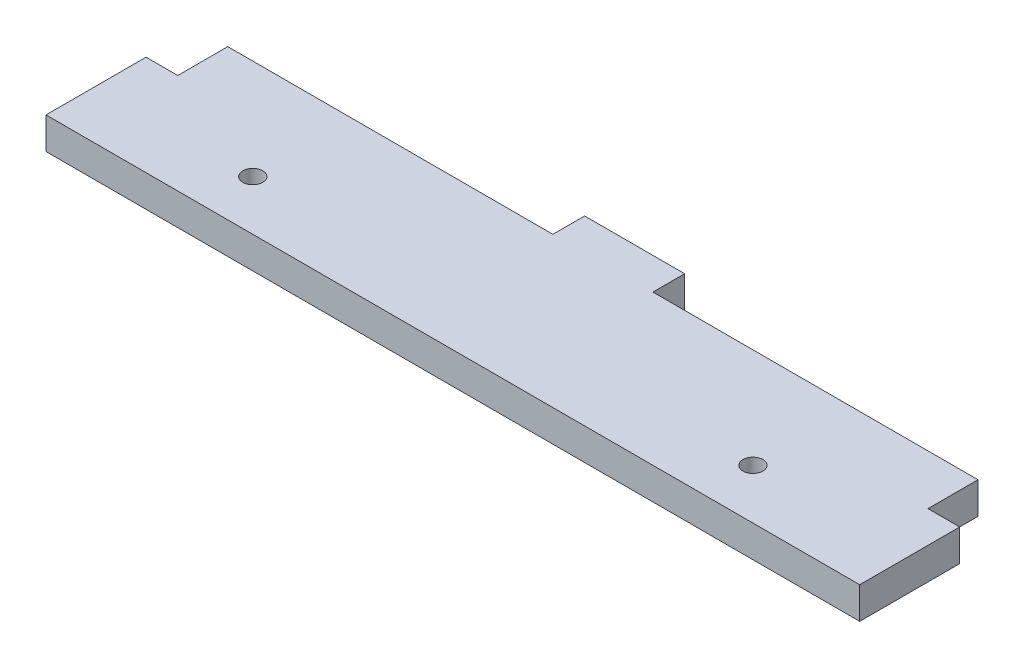
ISO-10303-21;
HEADER;
FILE_DESCRIPTION(('STEP AP214'),'2;1');
FILE_NAME('part.step','',(''),(''),'','','');
FILE_SCHEMA(('AUTOMOTIVE_DESIGN { 1 0 10303 214 1 1 1 1 }'));
ENDSEC;
DATA;
#1=APPLICATION_CONTEXT('core data for automotive mechanical design processes');
#2=APPLICATION_PROTOCOL_DEFINITION('international standard','automotive_design',2000,#1);
#3=PRODUCT_CONTEXT('',#1,'mechanical');
#4=PRODUCT('Part','Part','',(#3));
#5=PRODUCT_RELATED_PRODUCT_CATEGORY('part','',(#4));
#6=PRODUCT_DEFINITION_FORMATION('','',#4);
#7=PRODUCT_DEFINITION_CONTEXT('part definition',#1,'design');
#8=PRODUCT_DEFINITION('design','',#6,#7);
#9=PRODUCT_DEFINITION_SHAPE('','',#8);
#10=(LENGTH_UNIT() NAMED_UNIT(*) SI_UNIT(.MILLI.,.METRE.));
#11=(NAMED_UNIT(*) PLANE_ANGLE_UNIT() SI_UNIT($,.RADIAN.));
#12=(NAMED_UNIT(*) SI_UNIT($,.STERADIAN.) SOLID_ANGLE_UNIT());
#13=UNCERTAINTY_MEASURE_WITH_UNIT(LENGTH_MEASURE(1.E-05),#10,'distance_accuracy_value','');
#14=(GEOMETRIC_REPRESENTATION_CONTEXT(3) GLOBAL_UNCERTAINTY_ASSIGNED_CONTEXT((#13)) GLOBAL_UNIT_ASSIGNED_CONTEXT((#10,
#11,#12)) REPRESENTATION_CONTEXT('',''));
#15=CARTESIAN_POINT('',(0.,0.,0.));
#16=DIRECTION('',(0.,0.,1.));
#17=DIRECTION('',(1.,0.,0.));
#18=AXIS2_PLACEMENT_3D('',#15,#16,#17);
#19=CARTESIAN_POINT('',(0.,3.175,0.));
#20=DIRECTION('',(0.,1.,0.));
#21=DIRECTION('',(0.,0.,1.));
#22=AXIS2_PLACEMENT_3D('',#19,#20,#21);
#23=PLANE('',#22);
#24=CARTESIAN_POINT('',(-50.,3.175,8.17500000000003));
#25=DIRECTION('',(0.,1.,0.));
#26=DIRECTION('',(0.,0.,1.));
#27=AXIS2_PLACEMENT_3D('',#24,#25,#26);
#28=CIRCLE('',#27,2.);
#29=CARTESIAN_POINT('',(-50.,3.175,10.175));
#30=VERTEX_POINT('',#29);
#31=EDGE_CURVE('E170',#30,#30,#28,.T.);
#32=ORIENTED_EDGE('',*,*,#31,.F.);
#33=EDGE_LOOP('',(#32));
#34=FACE_BOUND('',#33,.T.);
#35=DIRECTION('',(0.,0.,1.));
#36=VECTOR('',#35,1.);
#37=CARTESIAN_POINT('',(-81.35,3.175,-1.82499999999997));
#38=LINE('',#37,#36);
#39=CARTESIAN_POINT('',(-81.35,3.175,-1.82499999999997));
#40=VERTEX_POINT('',#39);
#41=CARTESIAN_POINT('',(-81.35,3.175,18.175));
#42=VERTEX_POINT('',#41);
#43=EDGE_CURVE('E200',#40,#42,#38,.T.);
#44=ORIENTED_EDGE('',*,*,#43,.T.);
#45=DIRECTION('',(1.,0.,0.));
#46=VECTOR('',#45,1.);
#47=CARTESIAN_POINT('',(-81.35,3.175,18.175));
#48=LINE('',#47,#46);
#49=CARTESIAN_POINT('',(81.35,3.175,18.175));
#50=VERTEX_POINT('',#49);
#51=EDGE_CURVE('E112',#42,#50,#48,.T.);
#52=ORIENTED_EDGE('',*,*,#51,.T.);
#53=DIRECTION('',(0.,0.,-1.));
#54=VECTOR('',#53,1.);
#55=CARTESIAN_POINT('',(81.35,3.175,18.175));
#56=LINE('',#55,#54);
#57=CARTESIAN_POINT('',(81.35,3.175,-1.82500000000001));
#58=VERTEX_POINT('',#57);
#59=EDGE_CURVE('E237',#50,#58,#56,.T.);
#60=ORIENTED_EDGE('',*,*,#59,.T.);
#61=DIRECTION('',(-1.,0.,0.));
#62=VECTOR('',#61,1.);
#63=CARTESIAN_POINT('',(81.35,3.175,-1.82500000000001));
#64=LINE('',#63,#62);
#65=CARTESIAN_POINT('',(75.,3.175,-1.825));
#66=VERTEX_POINT('',#65);
#67=EDGE_CURVE('E257',#58,#66,#64,.T.);
#68=ORIENTED_EDGE('',*,*,#67,.T.);
#69=DIRECTION('',(0.,0.,-1.));
#70=VECTOR('',#69,1.);
#71=CARTESIAN_POINT('',(75.,3.175,-1.825));
#72=LINE('',#71,#70);
#73=CARTESIAN_POINT('',(75.,3.175,-11.825));
#74=VERTEX_POINT('',#73);
#75=EDGE_CURVE('E253',#66,#74,#72,.T.);
#76=ORIENTED_EDGE('',*,*,#75,.T.);
#77=DIRECTION('',(-1.,0.,0.));
#78=VECTOR('',#77,1.);
#79=CARTESIAN_POINT('',(75.,3.175,-11.825));
#80=LINE('',#79,#78);
#81=CARTESIAN_POINT('',(10.,3.175,-11.825));
#82=VERTEX_POINT('',#81);
#83=EDGE_CURVE('E256',#74,#82,#80,.T.);
#84=ORIENTED_EDGE('',*,*,#83,.T.);
#85=DIRECTION('',(0.,0.,-1.));
#86=VECTOR('',#85,1.);
#87=CARTESIAN_POINT('',(10.,3.175,-11.825));
#88=LINE('',#87,#86);
#89=CARTESIAN_POINT('',(10.,3.175,-18.175));
#90=VERTEX_POINT('',#89);
#91=EDGE_CURVE('E261',#82,#90,#88,.T.);
#92=ORIENTED_EDGE('',*,*,#91,.T.);
#93=DIRECTION('',(-1.,0.,0.));
#94=VECTOR('',#93,1.);
#95=CARTESIAN_POINT('',(10.,3.175,-18.175));
#96=LINE('',#95,#94);
#97=CARTESIAN_POINT('',(-9.99999999999999,3.175,-18.175));
#98=VERTEX_POINT('',#97);
#99=EDGE_CURVE('E268',#90,#98,#96,.T.);
#100=ORIENTED_EDGE('',*,*,#99,.T.);
#101=DIRECTION('',(0.,0.,1.));
#102=VECTOR('',#101,1.);
#103=CARTESIAN_POINT('',(-9.99999999999999,3.175,-18.175));
#104=LINE('',#103,#102);
#105=CARTESIAN_POINT('',(-9.99999999999999,3.175,-11.825));
#106=VERTEX_POINT('',#105);
#107=EDGE_CURVE('E143',#98,#106,#104,.T.);
#108=ORIENTED_EDGE('',*,*,#107,.T.);
#109=DIRECTION('',(-1.,0.,0.));
#110=VECTOR('',#109,1.);
#111=CARTESIAN_POINT('',(-9.99999999999999,3.175,-11.825));
#112=LINE('',#111,#110);
#113=CARTESIAN_POINT('',(-75.,3.175,-11.825));
#114=VERTEX_POINT('',#113);
#115=EDGE_CURVE('E137',#106,#114,#112,.T.);
#116=ORIENTED_EDGE('',*,*,#115,.T.);
#117=DIRECTION('',(0.,0.,1.));
#118=VECTOR('',#117,1.);
#119=CARTESIAN_POINT('',(-75.,3.175,-11.825));
#120=LINE('',#119,#118);
#121=CARTESIAN_POINT('',(-75.,3.175,-1.825));
#122=VERTEX_POINT('',#121);
#123=EDGE_CURVE('E141',#114,#122,#120,.T.);
#124=ORIENTED_EDGE('',*,*,#123,.T.);
#125=DIRECTION('',(-1.,0.,0.));
#126=VECTOR('',#125,1.);
#127=CARTESIAN_POINT('',(-75.,3.175,-1.825));
#128=LINE('',#127,#126);
#129=EDGE_CURVE('E57',#122,#40,#128,.T.);
#130=ORIENTED_EDGE('',*,*,#129,.T.);
#131=EDGE_LOOP('',(#44,#52,#60,#68,#76,#84,#92,#100,#108,#116,#124,#130));
#132=FACE_BOUND('',#131,.T.);
#133=CARTESIAN_POINT('',(50.,3.175,8.17500000000001));
#134=DIRECTION('',(0.,1.,0.));
#135=DIRECTION('',(0.,0.,1.));
#136=AXIS2_PLACEMENT_3D('',#133,#134,#135);
#137=CIRCLE('',#136,2.);
#138=CARTESIAN_POINT('',(50.,3.175,10.175));
#139=VERTEX_POINT('',#138);
#140=EDGE_CURVE('E312',#139,#139,#137,.T.);
#141=ORIENTED_EDGE('',*,*,#140,.F.);
#142=EDGE_LOOP('',(#141));
#143=FACE_BOUND('',#142,.T.);
#144=ADVANCED_FACE('F39',(#34,#132,#143),#23,.T.);
#145=CARTESIAN_POINT('',(0.,-3.175,0.));
#146=DIRECTION('',(0.,1.,0.));
#147=DIRECTION('',(0.,0.,1.));
#148=AXIS2_PLACEMENT_3D('',#145,#146,#147);
#149=PLANE('',#148);
#150=DIRECTION('',(0.,0.,1.));
#151=VECTOR('',#150,1.);
#152=CARTESIAN_POINT('',(-81.35,-3.175,-1.82499999999997));
#153=LINE('',#152,#151);
#154=CARTESIAN_POINT('',(-81.35,-3.175,-1.82499999999997));
#155=VERTEX_POINT('',#154);
#156=CARTESIAN_POINT('',(-81.35,-3.175,18.175));
#157=VERTEX_POINT('',#156);
#158=EDGE_CURVE('E165',#155,#157,#153,.T.);
#159=ORIENTED_EDGE('',*,*,#158,.F.);
#160=DIRECTION('',(-1.,0.,0.));
#161=VECTOR('',#160,1.);
#162=CARTESIAN_POINT('',(-75.,-3.175,-1.825));
#163=LINE('',#162,#161);
#164=CARTESIAN_POINT('',(-75.,-3.175,-1.825));
#165=VERTEX_POINT('',#164);
#166=EDGE_CURVE('E104',#165,#155,#163,.T.);
#167=ORIENTED_EDGE('',*,*,#166,.F.);
#168=DIRECTION('',(0.,0.,1.));
#169=VECTOR('',#168,1.);
#170=CARTESIAN_POINT('',(-75.,-3.175,-11.825));
#171=LINE('',#170,#169);
#172=CARTESIAN_POINT('',(-75.,-3.175,-11.825));
#173=VERTEX_POINT('',#172);
#174=EDGE_CURVE('E98',#173,#165,#171,.T.);
#175=ORIENTED_EDGE('',*,*,#174,.F.);
#176=DIRECTION('',(-1.,0.,0.));
#177=VECTOR('',#176,1.);
#178=CARTESIAN_POINT('',(-9.99999999999999,-3.175,-11.825));
#179=LINE('',#178,#177);
#180=CARTESIAN_POINT('',(-9.99999999999999,-3.175,-11.825));
#181=VERTEX_POINT('',#180);
#182=EDGE_CURVE('E152',#181,#173,#179,.T.);
#183=ORIENTED_EDGE('',*,*,#182,.F.);
#184=DIRECTION('',(0.,0.,1.));
#185=VECTOR('',#184,1.);
#186=CARTESIAN_POINT('',(-9.99999999999999,-3.175,-18.175));
#187=LINE('',#186,#185);
#188=CARTESIAN_POINT('',(-9.99999999999999,-3.175,-18.175));
#189=VERTEX_POINT('',#188);
#190=EDGE_CURVE('E191',#189,#181,#187,.T.);
#191=ORIENTED_EDGE('',*,*,#190,.F.);
#192=DIRECTION('',(-1.,0.,0.));
#193=VECTOR('',#192,1.);
#194=CARTESIAN_POINT('',(10.,-3.175,-18.175));
#195=LINE('',#194,#193);
#196=CARTESIAN_POINT('',(10.,-3.175,-18.175));
#197=VERTEX_POINT('',#196);
#198=EDGE_CURVE('E188',#197,#189,#195,.T.);
#199=ORIENTED_EDGE('',*,*,#198,.F.);
#200=DIRECTION('',(0.,0.,-1.));
#201=VECTOR('',#200,1.);
#202=CARTESIAN_POINT('',(10.,-3.175,-11.825));
#203=LINE('',#202,#201);
#204=CARTESIAN_POINT('',(10.,-3.175,-11.825));
#205=VERTEX_POINT('',#204);
#206=EDGE_CURVE('E185',#205,#197,#203,.T.);
#207=ORIENTED_EDGE('',*,*,#206,.F.);
#208=DIRECTION('',(-1.,0.,0.));
#209=VECTOR('',#208,1.);
#210=CARTESIAN_POINT('',(75.,-3.175,-11.825));
#211=LINE('',#210,#209);
#212=CARTESIAN_POINT('',(75.,-3.175,-11.825));
#213=VERTEX_POINT('',#212);
#214=EDGE_CURVE('E182',#213,#205,#211,.T.);
#215=ORIENTED_EDGE('',*,*,#214,.F.);
#216=DIRECTION('',(0.,0.,-1.));
#217=VECTOR('',#216,1.);
#218=CARTESIAN_POINT('',(75.,-3.175,-1.825));
#219=LINE('',#218,#217);
#220=CARTESIAN_POINT('',(75.,-3.175,-1.825));
#221=VERTEX_POINT('',#220);
#222=EDGE_CURVE('E179',#221,#213,#219,.T.);
#223=ORIENTED_EDGE('',*,*,#222,.F.);
#224=DIRECTION('',(-1.,0.,0.));
#225=VECTOR('',#224,1.);
#226=CARTESIAN_POINT('',(81.35,-3.175,-1.82500000000001));
#227=LINE('',#226,#225);
#228=CARTESIAN_POINT('',(81.35,-3.175,-1.82500000000001));
#229=VERTEX_POINT('',#228);
#230=EDGE_CURVE('E176',#229,#221,#227,.T.);
#231=ORIENTED_EDGE('',*,*,#230,.F.);
#232=DIRECTION('',(0.,0.,-1.));
#233=VECTOR('',#232,1.);
#234=CARTESIAN_POINT('',(81.35,-3.175,18.175));
#235=LINE('',#234,#233);
#236=CARTESIAN_POINT('',(81.35,-3.175,18.175));
#237=VERTEX_POINT('',#236);
#238=EDGE_CURVE('E173',#237,#229,#235,.T.);
#239=ORIENTED_EDGE('',*,*,#238,.F.);
#240=DIRECTION('',(1.,0.,0.));
#241=VECTOR('',#240,1.);
#242=CARTESIAN_POINT('',(-81.35,-3.175,18.175));
#243=LINE('',#242,#241);
#244=EDGE_CURVE('E169',#157,#237,#243,.T.);
#245=ORIENTED_EDGE('',*,*,#244,.F.);
#246=EDGE_LOOP('',(#159,#167,#175,#183,#191,#199,#207,#215,#223,#231,#239,#245));
#247=FACE_BOUND('',#246,.T.);
#248=CARTESIAN_POINT('',(-50.,-3.175,8.17500000000003));
#249=DIRECTION('',(0.,1.,0.));
#250=DIRECTION('',(0.,0.,1.));
#251=AXIS2_PLACEMENT_3D('',#248,#249,#250);
#252=CIRCLE('',#251,2.);
#253=CARTESIAN_POINT('',(-50.,-3.175,10.175));
#254=VERTEX_POINT('',#253);
#255=EDGE_CURVE('E320',#254,#254,#252,.T.);
#256=ORIENTED_EDGE('',*,*,#255,.T.);
#257=EDGE_LOOP('',(#256));
#258=FACE_BOUND('',#257,.T.);
#259=CARTESIAN_POINT('',(50.,-3.175,8.17500000000001));
#260=DIRECTION('',(0.,1.,0.));
#261=DIRECTION('',(0.,0.,1.));
#262=AXIS2_PLACEMENT_3D('',#259,#260,#261);
#263=CIRCLE('',#262,2.);
#264=CARTESIAN_POINT('',(50.,-3.175,10.175));
#265=VERTEX_POINT('',#264);
#266=EDGE_CURVE('E315',#265,#265,#263,.T.);
#267=ORIENTED_EDGE('',*,*,#266,.T.);
#268=EDGE_LOOP('',(#267));
#269=FACE_BOUND('',#268,.T.);
#270=ADVANCED_FACE('F241',(#247,#258,#269),#149,.F.);
#271=CARTESIAN_POINT('',(-81.35,3.175,-1.82499999999997));
#272=DIRECTION('',(1.,0.,0.));
#273=DIRECTION('',(0.,0.,-1.));
#274=AXIS2_PLACEMENT_3D('',#271,#272,#273);
#275=PLANE('',#274);
#276=ORIENTED_EDGE('',*,*,#158,.T.);
#277=DIRECTION('',(0.,-1.,0.));
#278=VECTOR('',#277,1.);
#279=CARTESIAN_POINT('',(-81.35,3.175,18.175));
#280=LINE('',#279,#278);
#281=EDGE_CURVE('E11',#42,#157,#280,.T.);
#282=ORIENTED_EDGE('',*,*,#281,.F.);
#283=ORIENTED_EDGE('',*,*,#43,.F.);
#284=DIRECTION('',(0.,-1.,0.));
#285=VECTOR('',#284,1.);
#286=CARTESIAN_POINT('',(-81.35,3.175,-1.82499999999997));
#287=LINE('',#286,#285);
#288=EDGE_CURVE('E161',#40,#155,#287,.T.);
#289=ORIENTED_EDGE('',*,*,#288,.T.);
#290=EDGE_LOOP('',(#276,#282,#283,#289));
#291=FACE_BOUND('',#290,.T.);
#292=ADVANCED_FACE('F41',(#291),#275,.F.);
#293=CARTESIAN_POINT('',(-81.35,3.175,18.175));
#294=DIRECTION('',(0.,0.,-1.));
#295=DIRECTION('',(-1.,0.,0.));
#296=AXIS2_PLACEMENT_3D('',#293,#294,#295);
#297=PLANE('',#296);
#298=ORIENTED_EDGE('',*,*,#244,.T.);
#299=DIRECTION('',(0.,-1.,0.));
#300=VECTOR('',#299,1.);
#301=CARTESIAN_POINT('',(81.35,3.175,18.175));
#302=LINE('',#301,#300);
#303=EDGE_CURVE('E49',#50,#237,#302,.T.);
#304=ORIENTED_EDGE('',*,*,#303,.F.);
#305=ORIENTED_EDGE('',*,*,#51,.F.);
#306=ORIENTED_EDGE('',*,*,#281,.T.);
#307=EDGE_LOOP('',(#298,#304,#305,#306));
#308=FACE_BOUND('',#307,.T.);
#309=ADVANCED_FACE('F418',(#308),#297,.F.);
#310=CARTESIAN_POINT('',(81.35,3.175,18.175));
#311=DIRECTION('',(-1.,0.,0.));
#312=DIRECTION('',(0.,0.,1.));
#313=AXIS2_PLACEMENT_3D('',#310,#311,#312);
#314=PLANE('',#313);
#315=ORIENTED_EDGE('',*,*,#238,.T.);
#316=DIRECTION('',(0.,-1.,0.));
#317=VECTOR('',#316,1.);
#318=CARTESIAN_POINT('',(81.35,3.175,-1.82500000000001));
#319=LINE('',#318,#317);
#320=EDGE_CURVE('E227',#58,#229,#319,.T.);
#321=ORIENTED_EDGE('',*,*,#320,.F.);
#322=ORIENTED_EDGE('',*,*,#59,.F.);
#323=ORIENTED_EDGE('',*,*,#303,.T.);
#324=EDGE_LOOP('',(#315,#321,#322,#323));
#325=FACE_BOUND('',#324,.T.);
#326=ADVANCED_FACE('F235',(#325),#314,.F.);
#327=CARTESIAN_POINT('',(81.35,3.175,-1.82500000000001));
#328=DIRECTION('',(0.,0.,1.));
#329=DIRECTION('',(1.,0.,0.));
#330=AXIS2_PLACEMENT_3D('',#327,#328,#329);
#331=PLANE('',#330);
#332=ORIENTED_EDGE('',*,*,#230,.T.);
#333=DIRECTION('',(0.,-1.,0.));
#334=VECTOR('',#333,1.);
#335=CARTESIAN_POINT('',(75.,3.175,-1.825));
#336=LINE('',#335,#334);
#337=EDGE_CURVE('E223',#66,#221,#336,.T.);
#338=ORIENTED_EDGE('',*,*,#337,.F.);
#339=ORIENTED_EDGE('',*,*,#67,.F.);
#340=ORIENTED_EDGE('',*,*,#320,.T.);
#341=EDGE_LOOP('',(#332,#338,#339,#340));
#342=FACE_BOUND('',#341,.T.);
#343=ADVANCED_FACE('F247',(#342),#331,.F.);
#344=CARTESIAN_POINT('',(75.,3.175,-1.825));
#345=DIRECTION('',(-1.,0.,0.));
#346=DIRECTION('',(0.,0.,1.));
#347=AXIS2_PLACEMENT_3D('',#344,#345,#346);
#348=PLANE('',#347);
#349=ORIENTED_EDGE('',*,*,#222,.T.);
#350=DIRECTION('',(0.,-1.,0.));
#351=VECTOR('',#350,1.);
#352=CARTESIAN_POINT('',(75.,3.175,-11.825));
#353=LINE('',#352,#351);
#354=EDGE_CURVE('E219',#74,#213,#353,.T.);
#355=ORIENTED_EDGE('',*,*,#354,.F.);
#356=ORIENTED_EDGE('',*,*,#75,.F.);
#357=ORIENTED_EDGE('',*,*,#337,.T.);
#358=EDGE_LOOP('',(#349,#355,#356,#357));
#359=FACE_BOUND('',#358,.T.);
#360=ADVANCED_FACE('F251',(#359),#348,.F.);
#361=CARTESIAN_POINT('',(75.,3.175,-11.825));
#362=DIRECTION('',(0.,0.,1.));
#363=DIRECTION('',(1.,0.,0.));
#364=AXIS2_PLACEMENT_3D('',#361,#362,#363);
#365=PLANE('',#364);
#366=ORIENTED_EDGE('',*,*,#214,.T.);
#367=DIRECTION('',(0.,-1.,0.));
#368=VECTOR('',#367,1.);
#369=CARTESIAN_POINT('',(10.,3.175,-11.825));
#370=LINE('',#369,#368);
#371=EDGE_CURVE('E215',#82,#205,#370,.T.);
#372=ORIENTED_EDGE('',*,*,#371,.F.);
#373=ORIENTED_EDGE('',*,*,#83,.F.);
#374=ORIENTED_EDGE('',*,*,#354,.T.);
#375=EDGE_LOOP('',(#366,#372,#373,#374));
#376=FACE_BOUND('',#375,.T.);
#377=ADVANCED_FACE('F383',(#376),#365,.F.);
#378=CARTESIAN_POINT('',(10.,3.175,-11.825));
#379=DIRECTION('',(-1.,0.,0.));
#380=DIRECTION('',(0.,0.,1.));
#381=AXIS2_PLACEMENT_3D('',#378,#379,#380);
#382=PLANE('',#381);
#383=ORIENTED_EDGE('',*,*,#206,.T.);
#384=DIRECTION('',(0.,-1.,0.));
#385=VECTOR('',#384,1.);
#386=CARTESIAN_POINT('',(10.,3.175,-18.175));
#387=LINE('',#386,#385);
#388=EDGE_CURVE('E211',#90,#197,#387,.T.);
#389=ORIENTED_EDGE('',*,*,#388,.F.);
#390=ORIENTED_EDGE('',*,*,#91,.F.);
#391=ORIENTED_EDGE('',*,*,#371,.T.);
#392=EDGE_LOOP('',(#383,#389,#390,#391));
#393=FACE_BOUND('',#392,.T.);
#394=ADVANCED_FACE('F374',(#393),#382,.F.);
#395=CARTESIAN_POINT('',(10.,3.175,-18.175));
#396=DIRECTION('',(0.,0.,1.));
#397=DIRECTION('',(1.,0.,0.));
#398=AXIS2_PLACEMENT_3D('',#395,#396,#397);
#399=PLANE('',#398);
#400=ORIENTED_EDGE('',*,*,#198,.T.);
#401=DIRECTION('',(0.,-1.,0.));
#402=VECTOR('',#401,1.);
#403=CARTESIAN_POINT('',(-9.99999999999999,3.175,-18.175));
#404=LINE('',#403,#402);
#405=EDGE_CURVE('E207',#98,#189,#404,.T.);
#406=ORIENTED_EDGE('',*,*,#405,.F.);
#407=ORIENTED_EDGE('',*,*,#99,.F.);
#408=ORIENTED_EDGE('',*,*,#388,.T.);
#409=EDGE_LOOP('',(#400,#406,#407,#408));
#410=FACE_BOUND('',#409,.T.);
#411=ADVANCED_FACE('F276',(#410),#399,.F.);
#412=CARTESIAN_POINT('',(-9.99999999999999,3.175,-18.175));
#413=DIRECTION('',(1.,0.,0.));
#414=DIRECTION('',(0.,0.,-1.));
#415=AXIS2_PLACEMENT_3D('',#412,#413,#414);
#416=PLANE('',#415);
#417=ORIENTED_EDGE('',*,*,#190,.T.);
#418=DIRECTION('',(0.,-1.,0.));
#419=VECTOR('',#418,1.);
#420=CARTESIAN_POINT('',(-9.99999999999999,3.175,-11.825));
#421=LINE('',#420,#419);
#422=EDGE_CURVE('E154',#106,#181,#421,.T.);
#423=ORIENTED_EDGE('',*,*,#422,.F.);
#424=ORIENTED_EDGE('',*,*,#107,.F.);
#425=ORIENTED_EDGE('',*,*,#405,.T.);
#426=EDGE_LOOP('',(#417,#423,#424,#425));
#427=FACE_BOUND('',#426,.T.);
#428=ADVANCED_FACE('F280',(#427),#416,.F.);
#429=CARTESIAN_POINT('',(-9.99999999999999,3.175,-11.825));
#430=DIRECTION('',(0.,0.,1.));
#431=DIRECTION('',(1.,0.,0.));
#432=AXIS2_PLACEMENT_3D('',#429,#430,#431);
#433=PLANE('',#432);
#434=ORIENTED_EDGE('',*,*,#182,.T.);
#435=DIRECTION('',(0.,-1.,0.));
#436=VECTOR('',#435,1.);
#437=CARTESIAN_POINT('',(-75.,3.175,-11.825));
#438=LINE('',#437,#436);
#439=EDGE_CURVE('E149',#114,#173,#438,.T.);
#440=ORIENTED_EDGE('',*,*,#439,.F.);
#441=ORIENTED_EDGE('',*,*,#115,.F.);
#442=ORIENTED_EDGE('',*,*,#422,.T.);
#443=EDGE_LOOP('',(#434,#440,#441,#442));
#444=FACE_BOUND('',#443,.T.);
#445=ADVANCED_FACE('F150',(#444),#433,.F.);
#446=CARTESIAN_POINT('',(-75.,3.175,-11.825));
#447=DIRECTION('',(1.,0.,0.));
#448=DIRECTION('',(0.,0.,-1.));
#449=AXIS2_PLACEMENT_3D('',#446,#447,#448);
#450=PLANE('',#449);
#451=ORIENTED_EDGE('',*,*,#174,.T.);
#452=DIRECTION('',(0.,-1.,0.));
#453=VECTOR('',#452,1.);
#454=CARTESIAN_POINT('',(-75.,3.175,-1.825));
#455=LINE('',#454,#453);
#456=EDGE_CURVE('E155',#122,#165,#455,.T.);
#457=ORIENTED_EDGE('',*,*,#456,.F.);
#458=ORIENTED_EDGE('',*,*,#123,.F.);
#459=ORIENTED_EDGE('',*,*,#439,.T.);
#460=EDGE_LOOP('',(#451,#457,#458,#459));
#461=FACE_BOUND('',#460,.T.);
#462=ADVANCED_FACE('F157',(#461),#450,.F.);
#463=CARTESIAN_POINT('',(-75.,3.175,-1.825));
#464=DIRECTION('',(0.,0.,1.));
#465=DIRECTION('',(1.,0.,0.));
#466=AXIS2_PLACEMENT_3D('',#463,#464,#465);
#467=PLANE('',#466);
#468=ORIENTED_EDGE('',*,*,#166,.T.);
#469=ORIENTED_EDGE('',*,*,#288,.F.);
#470=ORIENTED_EDGE('',*,*,#129,.F.);
#471=ORIENTED_EDGE('',*,*,#456,.T.);
#472=EDGE_LOOP('',(#468,#469,#470,#471));
#473=FACE_BOUND('',#472,.T.);
#474=ADVANCED_FACE('F284',(#473),#467,.F.);
#475=CARTESIAN_POINT('',(-50.,3.175,8.17500000000003));
#476=DIRECTION('',(0.,-1.,0.));
#477=DIRECTION('',(0.,0.,-1.));
#478=AXIS2_PLACEMENT_3D('',#475,#476,#477);
#479=CYLINDRICAL_SURFACE('',#478,2.);
#480=ORIENTED_EDGE('',*,*,#31,.T.);
#481=EDGE_LOOP('',(#480));
#482=FACE_BOUND('',#481,.T.);
#483=ORIENTED_EDGE('',*,*,#255,.F.);
#484=EDGE_LOOP('',(#483));
#485=FACE_BOUND('',#484,.T.);
#486=ADVANCED_FACE('F286',(#482,#485),#479,.F.);
#487=CARTESIAN_POINT('',(50.,3.175,8.17500000000001));
#488=DIRECTION('',(0.,-1.,0.));
#489=DIRECTION('',(0.,0.,-1.));
#490=AXIS2_PLACEMENT_3D('',#487,#488,#489);
#491=CYLINDRICAL_SURFACE('',#490,2.);
#492=ORIENTED_EDGE('',*,*,#140,.T.);
#493=EDGE_LOOP('',(#492));
#494=FACE_BOUND('',#493,.T.);
#495=ORIENTED_EDGE('',*,*,#266,.F.);
#496=EDGE_LOOP('',(#495));
#497=FACE_BOUND('',#496,.T.);
#498=ADVANCED_FACE('F292',(#494,#497),#491,.F.);
#499=CLOSED_SHELL('',(#144,#270,#292,#309,#326,#343,#360,#377,#394,#411,#428,#445,#462,#474,
#486,#498));
#500=MANIFOLD_SOLID_BREP('B2',#499);
#501=ADVANCED_BREP_SHAPE_REPRESENTATION('',(#18,#500),#14);
#502=SHAPE_DEFINITION_REPRESENTATION(#9,#501);
ENDSEC;
END-ISO-10303-21;
